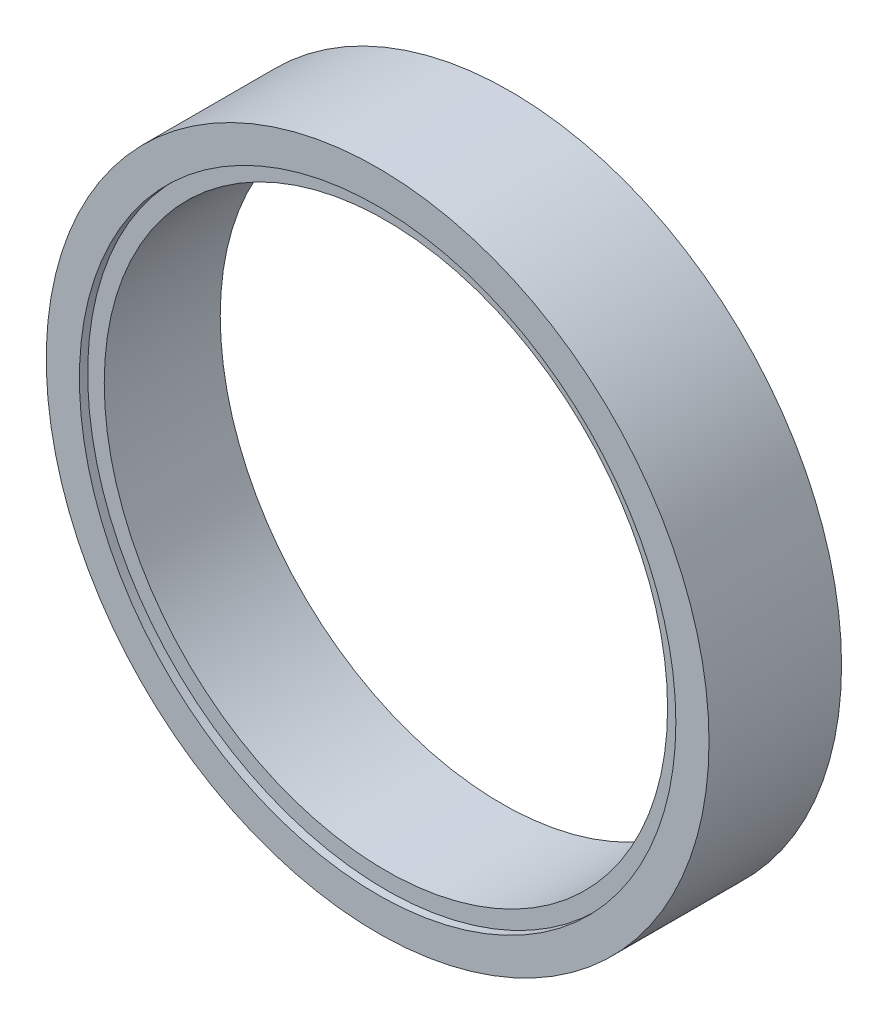
ISO-10303-21;
HEADER;
FILE_DESCRIPTION(('STEP AP214'),'2;1');
FILE_NAME('part.step','',(''),(''),'','','');
FILE_SCHEMA(('AUTOMOTIVE_DESIGN { 1 0 10303 214 1 1 1 1 }'));
ENDSEC;
DATA;
#1=APPLICATION_CONTEXT('core data for automotive mechanical design processes');
#2=APPLICATION_PROTOCOL_DEFINITION('international standard','automotive_design',2000,#1);
#3=PRODUCT_CONTEXT('',#1,'mechanical');
#4=PRODUCT('Part','Part','',(#3));
#5=PRODUCT_RELATED_PRODUCT_CATEGORY('part','',(#4));
#6=PRODUCT_DEFINITION_FORMATION('','',#4);
#7=PRODUCT_DEFINITION_CONTEXT('part definition',#1,'design');
#8=PRODUCT_DEFINITION('design','',#6,#7);
#9=PRODUCT_DEFINITION_SHAPE('','',#8);
#10=(LENGTH_UNIT() NAMED_UNIT(*) SI_UNIT(.MILLI.,.METRE.));
#11=(NAMED_UNIT(*) PLANE_ANGLE_UNIT() SI_UNIT($,.RADIAN.));
#12=(NAMED_UNIT(*) SI_UNIT($,.STERADIAN.) SOLID_ANGLE_UNIT());
#13=UNCERTAINTY_MEASURE_WITH_UNIT(LENGTH_MEASURE(1.E-05),#10,'distance_accuracy_value','');
#14=(GEOMETRIC_REPRESENTATION_CONTEXT(3) GLOBAL_UNCERTAINTY_ASSIGNED_CONTEXT((#13)) GLOBAL_UNIT_ASSIGNED_CONTEXT((#10,
#11,#12)) REPRESENTATION_CONTEXT('',''));
#15=CARTESIAN_POINT('',(0.,0.,0.));
#16=DIRECTION('',(0.,0.,1.));
#17=DIRECTION('',(1.,0.,0.));
#18=AXIS2_PLACEMENT_3D('',#15,#16,#17);
#19=CARTESIAN_POINT('',(0.,0.,12.7));
#20=DIRECTION('',(0.,0.,-1.));
#21=DIRECTION('',(-1.,0.,0.));
#22=AXIS2_PLACEMENT_3D('',#19,#20,#21);
#23=CYLINDRICAL_SURFACE('',#22,53.975);
#24=CARTESIAN_POINT('',(0.,0.,11.1125));
#25=DIRECTION('',(0.,0.,1.));
#26=DIRECTION('',(1.,0.,0.));
#27=AXIS2_PLACEMENT_3D('',#24,#25,#26);
#28=CIRCLE('',#27,53.975);
#29=CARTESIAN_POINT('',(53.975,0.,11.1125));
#30=VERTEX_POINT('',#29);
#31=EDGE_CURVE('E44',#30,#30,#28,.T.);
#32=ORIENTED_EDGE('',*,*,#31,.T.);
#33=EDGE_LOOP('',(#32));
#34=FACE_BOUND('',#33,.T.);
#35=CARTESIAN_POINT('',(0.,0.,-11.1125));
#36=DIRECTION('',(0.,0.,-1.));
#37=DIRECTION('',(-1.,0.,0.));
#38=AXIS2_PLACEMENT_3D('',#35,#36,#37);
#39=CIRCLE('',#38,53.975);
#40=CARTESIAN_POINT('',(-53.975,0.,-11.1125));
#41=VERTEX_POINT('',#40);
#42=EDGE_CURVE('E35',#41,#41,#39,.T.);
#43=ORIENTED_EDGE('',*,*,#42,.T.);
#44=EDGE_LOOP('',(#43));
#45=FACE_BOUND('',#44,.T.);
#46=ADVANCED_FACE('F31',(#34,#45),#23,.F.);
#47=CARTESIAN_POINT('',(0.,0.,12.7));
#48=DIRECTION('',(0.,0.,1.));
#49=DIRECTION('',(1.,0.,0.));
#50=AXIS2_PLACEMENT_3D('',#47,#48,#49);
#51=PLANE('',#50);
#52=CARTESIAN_POINT('',(0.,0.,12.7));
#53=DIRECTION('',(0.,0.,1.));
#54=DIRECTION('',(1.,0.,0.));
#55=AXIS2_PLACEMENT_3D('',#52,#53,#54);
#56=CIRCLE('',#55,57.15);
#57=CARTESIAN_POINT('',(57.15,0.,12.7));
#58=VERTEX_POINT('',#57);
#59=EDGE_CURVE('E47',#58,#58,#56,.T.);
#60=ORIENTED_EDGE('',*,*,#59,.F.);
#61=EDGE_LOOP('',(#60));
#62=FACE_BOUND('',#61,.T.);
#63=CARTESIAN_POINT('',(0.,0.,12.7));
#64=DIRECTION('',(0.,0.,1.));
#65=DIRECTION('',(1.,0.,0.));
#66=AXIS2_PLACEMENT_3D('',#63,#64,#65);
#67=CIRCLE('',#66,63.5);
#68=CARTESIAN_POINT('',(63.5,0.,12.7));
#69=VERTEX_POINT('',#68);
#70=EDGE_CURVE('E10',#69,#69,#67,.T.);
#71=ORIENTED_EDGE('',*,*,#70,.T.);
#72=EDGE_LOOP('',(#71));
#73=FACE_BOUND('',#72,.T.);
#74=ADVANCED_FACE('F80',(#62,#73),#51,.T.);
#75=CARTESIAN_POINT('',(0.,0.,-12.7));
#76=DIRECTION('',(0.,0.,1.));
#77=DIRECTION('',(1.,0.,0.));
#78=AXIS2_PLACEMENT_3D('',#75,#76,#77);
#79=PLANE('',#78);
#80=CARTESIAN_POINT('',(0.,0.,-12.7));
#81=DIRECTION('',(0.,0.,-1.));
#82=DIRECTION('',(-1.,0.,0.));
#83=AXIS2_PLACEMENT_3D('',#80,#81,#82);
#84=CIRCLE('',#83,57.15);
#85=CARTESIAN_POINT('',(-57.15,0.,-12.7));
#86=VERTEX_POINT('',#85);
#87=EDGE_CURVE('E58',#86,#86,#84,.T.);
#88=ORIENTED_EDGE('',*,*,#87,.F.);
#89=EDGE_LOOP('',(#88));
#90=FACE_BOUND('',#89,.T.);
#91=CARTESIAN_POINT('',(0.,0.,-12.7));
#92=DIRECTION('',(0.,0.,1.));
#93=DIRECTION('',(1.,0.,0.));
#94=AXIS2_PLACEMENT_3D('',#91,#92,#93);
#95=CIRCLE('',#94,63.5);
#96=CARTESIAN_POINT('',(63.5,0.,-12.7));
#97=VERTEX_POINT('',#96);
#98=EDGE_CURVE('E39',#97,#97,#95,.T.);
#99=ORIENTED_EDGE('',*,*,#98,.F.);
#100=EDGE_LOOP('',(#99));
#101=FACE_BOUND('',#100,.T.);
#102=ADVANCED_FACE('F85',(#90,#101),#79,.F.);
#103=CARTESIAN_POINT('',(0.,0.,12.7));
#104=DIRECTION('',(0.,0.,-1.));
#105=DIRECTION('',(-1.,0.,0.));
#106=AXIS2_PLACEMENT_3D('',#103,#104,#105);
#107=CYLINDRICAL_SURFACE('',#106,63.5);
#108=ORIENTED_EDGE('',*,*,#70,.F.);
#109=EDGE_LOOP('',(#108));
#110=FACE_BOUND('',#109,.T.);
#111=ORIENTED_EDGE('',*,*,#98,.T.);
#112=EDGE_LOOP('',(#111));
#113=FACE_BOUND('',#112,.T.);
#114=ADVANCED_FACE('F33',(#110,#113),#107,.T.);
#115=CARTESIAN_POINT('',(0.,0.,11.1125));
#116=DIRECTION('',(0.,0.,1.));
#117=DIRECTION('',(1.,0.,0.));
#118=AXIS2_PLACEMENT_3D('',#115,#116,#117);
#119=CYLINDRICAL_SURFACE('',#118,57.15);
#120=CARTESIAN_POINT('',(0.,0.,11.1125));
#121=DIRECTION('',(0.,0.,1.));
#122=DIRECTION('',(1.,0.,0.));
#123=AXIS2_PLACEMENT_3D('',#120,#121,#122);
#124=CIRCLE('',#123,57.15);
#125=CARTESIAN_POINT('',(57.15,0.,11.1125));
#126=VERTEX_POINT('',#125);
#127=EDGE_CURVE('E50',#126,#126,#124,.T.);
#128=ORIENTED_EDGE('',*,*,#127,.F.);
#129=EDGE_LOOP('',(#128));
#130=FACE_BOUND('',#129,.T.);
#131=ORIENTED_EDGE('',*,*,#59,.T.);
#132=EDGE_LOOP('',(#131));
#133=FACE_BOUND('',#132,.T.);
#134=ADVANCED_FACE('F89',(#130,#133),#119,.F.);
#135=CARTESIAN_POINT('',(0.,0.,11.1125));
#136=DIRECTION('',(0.,0.,1.));
#137=DIRECTION('',(1.,0.,0.));
#138=AXIS2_PLACEMENT_3D('',#135,#136,#137);
#139=PLANE('',#138);
#140=ORIENTED_EDGE('',*,*,#31,.F.);
#141=EDGE_LOOP('',(#140));
#142=FACE_BOUND('',#141,.T.);
#143=ORIENTED_EDGE('',*,*,#127,.T.);
#144=EDGE_LOOP('',(#143));
#145=FACE_BOUND('',#144,.T.);
#146=ADVANCED_FACE('F76',(#142,#145),#139,.T.);
#147=CARTESIAN_POINT('',(0.,0.,-11.1125));
#148=DIRECTION('',(0.,0.,-1.));
#149=DIRECTION('',(-1.,0.,0.));
#150=AXIS2_PLACEMENT_3D('',#147,#148,#149);
#151=CYLINDRICAL_SURFACE('',#150,57.15);
#152=CARTESIAN_POINT('',(0.,0.,-11.1125));
#153=DIRECTION('',(0.,0.,-1.));
#154=DIRECTION('',(-1.,0.,0.));
#155=AXIS2_PLACEMENT_3D('',#152,#153,#154);
#156=CIRCLE('',#155,57.15);
#157=CARTESIAN_POINT('',(-57.15,0.,-11.1125));
#158=VERTEX_POINT('',#157);
#159=EDGE_CURVE('E61',#158,#158,#156,.T.);
#160=ORIENTED_EDGE('',*,*,#159,.F.);
#161=EDGE_LOOP('',(#160));
#162=FACE_BOUND('',#161,.T.);
#163=ORIENTED_EDGE('',*,*,#87,.T.);
#164=EDGE_LOOP('',(#163));
#165=FACE_BOUND('',#164,.T.);
#166=ADVANCED_FACE('F71',(#162,#165),#151,.F.);
#167=CARTESIAN_POINT('',(0.,0.,-11.1125));
#168=DIRECTION('',(0.,0.,-1.));
#169=DIRECTION('',(-1.,0.,0.));
#170=AXIS2_PLACEMENT_3D('',#167,#168,#169);
#171=PLANE('',#170);
#172=ORIENTED_EDGE('',*,*,#42,.F.);
#173=EDGE_LOOP('',(#172));
#174=FACE_BOUND('',#173,.T.);
#175=ORIENTED_EDGE('',*,*,#159,.T.);
#176=EDGE_LOOP('',(#175));
#177=FACE_BOUND('',#176,.T.);
#178=ADVANCED_FACE('F69',(#174,#177),#171,.T.);
#179=CLOSED_SHELL('',(#46,#74,#102,#114,#134,#146,#166,#178));
#180=MANIFOLD_SOLID_BREP('B2',#179);
#181=ADVANCED_BREP_SHAPE_REPRESENTATION('',(#18,#180),#14);
#182=SHAPE_DEFINITION_REPRESENTATION(#9,#181);
ENDSEC;
END-ISO-10303-21;
